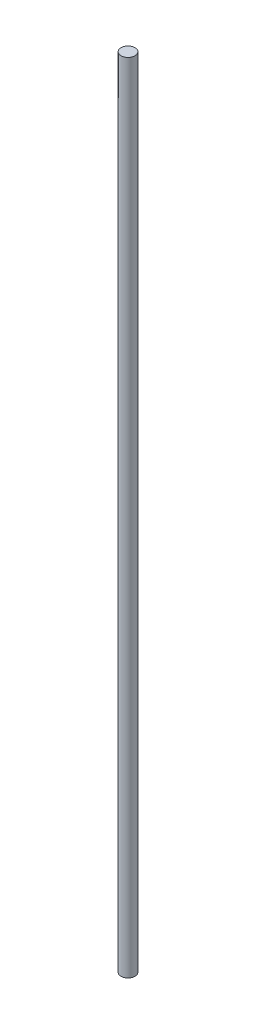
ISO-10303-21;
HEADER;
FILE_DESCRIPTION(('STEP AP214'),'2;1');
FILE_NAME('part.step','',(''),(''),'','','');
FILE_SCHEMA(('AUTOMOTIVE_DESIGN { 1 0 10303 214 1 1 1 1 }'));
ENDSEC;
DATA;
#1=APPLICATION_CONTEXT('core data for automotive mechanical design processes');
#2=APPLICATION_PROTOCOL_DEFINITION('international standard','automotive_design',2000,#1);
#3=PRODUCT_CONTEXT('',#1,'mechanical');
#4=PRODUCT('Part','Part','',(#3));
#5=PRODUCT_RELATED_PRODUCT_CATEGORY('part','',(#4));
#6=PRODUCT_DEFINITION_FORMATION('','',#4);
#7=PRODUCT_DEFINITION_CONTEXT('part definition',#1,'design');
#8=PRODUCT_DEFINITION('design','',#6,#7);
#9=PRODUCT_DEFINITION_SHAPE('','',#8);
#10=(LENGTH_UNIT() NAMED_UNIT(*) SI_UNIT(.MILLI.,.METRE.));
#11=(NAMED_UNIT(*) PLANE_ANGLE_UNIT() SI_UNIT($,.RADIAN.));
#12=(NAMED_UNIT(*) SI_UNIT($,.STERADIAN.) SOLID_ANGLE_UNIT());
#13=UNCERTAINTY_MEASURE_WITH_UNIT(LENGTH_MEASURE(1.E-05),#10,'distance_accuracy_value','');
#14=(GEOMETRIC_REPRESENTATION_CONTEXT(3) GLOBAL_UNCERTAINTY_ASSIGNED_CONTEXT((#13)) GLOBAL_UNIT_ASSIGNED_CONTEXT((#10,
#11,#12)) REPRESENTATION_CONTEXT('',''));
#15=CARTESIAN_POINT('',(0.,0.,0.));
#16=DIRECTION('',(0.,0.,1.));
#17=DIRECTION('',(1.,0.,0.));
#18=AXIS2_PLACEMENT_3D('',#15,#16,#17);
#19=CARTESIAN_POINT('',(0.,455.9,0.));
#20=DIRECTION('',(0.,-1.,0.));
#21=DIRECTION('',(0.,0.,-1.));
#22=AXIS2_PLACEMENT_3D('',#19,#20,#21);
#23=CYLINDRICAL_SURFACE('',#22,4.);
#24=CARTESIAN_POINT('',(0.,455.9,0.));
#25=DIRECTION('',(0.,1.,0.));
#26=DIRECTION('',(0.,0.,1.));
#27=AXIS2_PLACEMENT_3D('',#24,#25,#26);
#28=CIRCLE('',#27,4.);
#29=CARTESIAN_POINT('',(0.,455.9,-4.));
#30=VERTEX_POINT('',#29);
#31=EDGE_CURVE('E10',#30,#30,#28,.T.);
#32=CARTESIAN_POINT('',(0.,0.,0.));
#33=DIRECTION('',(0.,1.,0.));
#34=DIRECTION('',(0.,0.,1.));
#35=AXIS2_PLACEMENT_3D('',#32,#33,#34);
#36=CIRCLE('',#35,4.);
#37=CARTESIAN_POINT('',(0.,0.,-4.));
#38=VERTEX_POINT('',#37);
#39=EDGE_CURVE('E36',#38,#38,#36,.T.);
#40=CARTESIAN_POINT('',(0.,455.9,-4.));
#41=CARTESIAN_POINT('',(0.,451.151041666667,-4.));
#42=CARTESIAN_POINT('',(0.,446.402083333333,-4.));
#43=CARTESIAN_POINT('',(0.,436.904166666667,-4.));
#44=CARTESIAN_POINT('',(0.,432.155208333333,-4.));
#45=CARTESIAN_POINT('',(0.,422.657291666667,-4.));
#46=CARTESIAN_POINT('',(0.,417.908333333333,-4.));
#47=CARTESIAN_POINT('',(0.,408.410416666667,-4.));
#48=CARTESIAN_POINT('',(0.,403.661458333333,-4.));
#49=CARTESIAN_POINT('',(0.,394.163541666667,-4.));
#50=CARTESIAN_POINT('',(0.,389.414583333333,-4.));
#51=CARTESIAN_POINT('',(0.,379.916666666667,-4.));
#52=CARTESIAN_POINT('',(0.,375.167708333333,-4.));
#53=CARTESIAN_POINT('',(0.,365.669791666667,-4.));
#54=CARTESIAN_POINT('',(0.,360.920833333333,-4.));
#55=CARTESIAN_POINT('',(0.,351.422916666667,-4.));
#56=CARTESIAN_POINT('',(0.,346.673958333333,-4.));
#57=CARTESIAN_POINT('',(0.,337.176041666667,-4.));
#58=CARTESIAN_POINT('',(0.,332.427083333333,-4.));
#59=CARTESIAN_POINT('',(0.,322.929166666667,-4.));
#60=CARTESIAN_POINT('',(0.,318.180208333333,-4.));
#61=CARTESIAN_POINT('',(0.,308.682291666667,-4.));
#62=CARTESIAN_POINT('',(0.,303.933333333333,-4.));
#63=CARTESIAN_POINT('',(0.,294.435416666667,-4.));
#64=CARTESIAN_POINT('',(0.,289.686458333333,-4.));
#65=CARTESIAN_POINT('',(0.,280.188541666667,-4.));
#66=CARTESIAN_POINT('',(0.,275.439583333333,-4.));
#67=CARTESIAN_POINT('',(0.,265.941666666667,-4.));
#68=CARTESIAN_POINT('',(0.,261.192708333333,-4.));
#69=CARTESIAN_POINT('',(0.,251.694791666667,-4.));
#70=CARTESIAN_POINT('',(0.,246.945833333333,-4.));
#71=CARTESIAN_POINT('',(0.,237.447916666667,-4.));
#72=CARTESIAN_POINT('',(0.,232.698958333333,-4.));
#73=CARTESIAN_POINT('',(0.,223.201041666667,-4.));
#74=CARTESIAN_POINT('',(0.,218.452083333333,-4.));
#75=CARTESIAN_POINT('',(0.,208.954166666667,-4.));
#76=CARTESIAN_POINT('',(0.,204.205208333333,-4.));
#77=CARTESIAN_POINT('',(0.,194.707291666667,-4.));
#78=CARTESIAN_POINT('',(0.,189.958333333333,-4.));
#79=CARTESIAN_POINT('',(0.,180.460416666667,-4.));
#80=CARTESIAN_POINT('',(0.,175.711458333333,-4.));
#81=CARTESIAN_POINT('',(0.,166.213541666667,-4.));
#82=CARTESIAN_POINT('',(0.,161.464583333333,-4.));
#83=CARTESIAN_POINT('',(0.,151.966666666667,-4.));
#84=CARTESIAN_POINT('',(0.,147.217708333333,-4.));
#85=CARTESIAN_POINT('',(0.,137.719791666667,-4.));
#86=CARTESIAN_POINT('',(0.,132.970833333333,-4.));
#87=CARTESIAN_POINT('',(0.,123.472916666667,-4.));
#88=CARTESIAN_POINT('',(0.,118.723958333333,-4.));
#89=CARTESIAN_POINT('',(0.,109.226041666667,-4.));
#90=CARTESIAN_POINT('',(0.,104.477083333333,-4.));
#91=CARTESIAN_POINT('',(0.,94.9791666666667,-4.));
#92=CARTESIAN_POINT('',(0.,90.2302083333333,-4.));
#93=CARTESIAN_POINT('',(0.,80.7322916666667,-4.));
#94=CARTESIAN_POINT('',(0.,75.9833333333333,-4.));
#95=CARTESIAN_POINT('',(0.,66.4854166666667,-4.));
#96=CARTESIAN_POINT('',(0.,61.7364583333334,-4.));
#97=CARTESIAN_POINT('',(0.,52.2385416666667,-4.));
#98=CARTESIAN_POINT('',(0.,47.4895833333333,-4.));
#99=CARTESIAN_POINT('',(0.,37.9916666666666,-4.));
#100=CARTESIAN_POINT('',(0.,33.2427083333333,-4.));
#101=CARTESIAN_POINT('',(0.,23.7447916666667,-4.));
#102=CARTESIAN_POINT('',(0.,18.9958333333333,-4.));
#103=CARTESIAN_POINT('',(0.,9.49791666666666,-4.));
#104=CARTESIAN_POINT('',(0.,4.74895833333333,-4.));
#105=CARTESIAN_POINT('',(0.,0.,-4.));
#106=B_SPLINE_CURVE_WITH_KNOTS('',3,(#40,#41,#42,#43,#44,#45,#46,#47,#48,#49,#50,#51,#52,#53,
#54,#55,#56,#57,#58,#59,#60,#61,#62,#63,#64,#65,#66,#67,#68,#69,#70,#71,#72,#73,#74,#75,#76,#77,
#78,#79,#80,#81,#82,#83,#84,#85,#86,#87,#88,#89,#90,#91,#92,#93,#94,#95,#96,#97,#98,#99,#100,
#101,#102,#103,#104,#105),.UNSPECIFIED.,.F.,.F.,(4,2,2,2,2,2,2,2,2,2,2,2,2,2,2,2,2,2,2,2,2,2,2,
2,2,2,2,2,2,2,2,2,4),(0.,14.246875,28.49375,42.740625,56.9875,71.234375,85.48125,
99.7281249999999,113.975,128.221875,142.46875,156.715625,170.9625,185.209375,199.45625,
213.703125,227.95,242.196875,256.44375,270.690625,284.9375,299.184375,313.43125,327.678125,
341.925,356.171875,370.41875,384.665625,398.9125,413.159375,427.40625,441.653125,455.9),.UNSPECIFIED.);
#107=EDGE_CURVE('BSEAM33',#30,#38,#106,.T.);
#108=ORIENTED_EDGE('',*,*,#31,.F.);
#109=ORIENTED_EDGE('',*,*,#39,.T.);
#110=ORIENTED_EDGE('',*,*,#107,.T.);
#111=ORIENTED_EDGE('',*,*,#107,.F.);
#112=EDGE_LOOP('',(#108,#110,#109,#111));
#113=FACE_BOUND('',#112,.T.);
#114=ADVANCED_FACE('F33',(#113),#23,.T.);
#115=CARTESIAN_POINT('',(0.,455.9,0.));
#116=DIRECTION('',(0.,1.,0.));
#117=DIRECTION('',(0.,0.,1.));
#118=AXIS2_PLACEMENT_3D('',#115,#116,#117);
#119=PLANE('',#118);
#120=ORIENTED_EDGE('',*,*,#31,.T.);
#121=EDGE_LOOP('',(#120));
#122=FACE_BOUND('',#121,.T.);
#123=ADVANCED_FACE('F48',(#122),#119,.T.);
#124=CARTESIAN_POINT('',(0.,0.,0.));
#125=DIRECTION('',(0.,1.,0.));
#126=DIRECTION('',(0.,0.,1.));
#127=AXIS2_PLACEMENT_3D('',#124,#125,#126);
#128=PLANE('',#127);
#129=ORIENTED_EDGE('',*,*,#39,.F.);
#130=EDGE_LOOP('',(#129));
#131=FACE_BOUND('',#130,.T.);
#132=ADVANCED_FACE('F46',(#131),#128,.F.);
#133=CLOSED_SHELL('',(#114,#123,#132));
#134=MANIFOLD_SOLID_BREP('B2',#133);
#135=ADVANCED_BREP_SHAPE_REPRESENTATION('',(#18,#134),#14);
#136=SHAPE_DEFINITION_REPRESENTATION(#9,#135);
ENDSEC;
END-ISO-10303-21;
